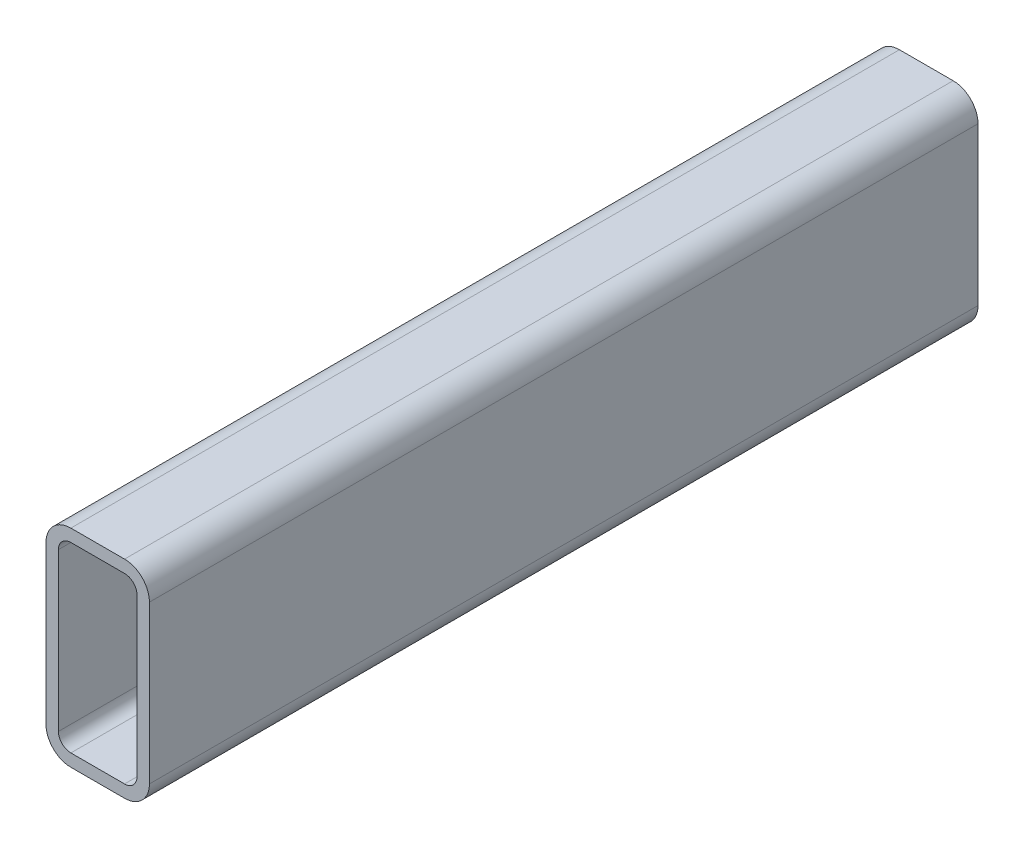
ISO-10303-21;
HEADER;
FILE_DESCRIPTION(('STEP AP214'),'2;1');
FILE_NAME('part.step','',(''),(''),'','','');
FILE_SCHEMA(('AUTOMOTIVE_DESIGN { 1 0 10303 214 1 1 1 1 }'));
ENDSEC;
DATA;
#1=APPLICATION_CONTEXT('core data for automotive mechanical design processes');
#2=APPLICATION_PROTOCOL_DEFINITION('international standard','automotive_design',2000,#1);
#3=PRODUCT_CONTEXT('',#1,'mechanical');
#4=PRODUCT('Part','Part','',(#3));
#5=PRODUCT_RELATED_PRODUCT_CATEGORY('part','',(#4));
#6=PRODUCT_DEFINITION_FORMATION('','',#4);
#7=PRODUCT_DEFINITION_CONTEXT('part definition',#1,'design');
#8=PRODUCT_DEFINITION('design','',#6,#7);
#9=PRODUCT_DEFINITION_SHAPE('','',#8);
#10=(LENGTH_UNIT() NAMED_UNIT(*) SI_UNIT(.MILLI.,.METRE.));
#11=(NAMED_UNIT(*) PLANE_ANGLE_UNIT() SI_UNIT($,.RADIAN.));
#12=(NAMED_UNIT(*) SI_UNIT($,.STERADIAN.) SOLID_ANGLE_UNIT());
#13=UNCERTAINTY_MEASURE_WITH_UNIT(LENGTH_MEASURE(1.E-05),#10,'distance_accuracy_value','');
#14=(GEOMETRIC_REPRESENTATION_CONTEXT(3) GLOBAL_UNCERTAINTY_ASSIGNED_CONTEXT((#13)) GLOBAL_UNIT_ASSIGNED_CONTEXT((#10,
#11,#12)) REPRESENTATION_CONTEXT('',''));
#15=CARTESIAN_POINT('',(0.,0.,0.));
#16=DIRECTION('',(0.,0.,1.));
#17=DIRECTION('',(1.,0.,0.));
#18=AXIS2_PLACEMENT_3D('',#15,#16,#17);
#19=CARTESIAN_POINT('',(6.00000000000001,6.00000000000006,200.000000000002));
#20=DIRECTION('',(0.,0.,-1.00000000000001));
#21=DIRECTION('',(-1.,0.,0.));
#22=AXIS2_PLACEMENT_3D('',#19,#20,#21);
#23=PLANE('',#22);
#24=CARTESIAN_POINT('',(6.00000000000001,6.00000000000006,200.000000000002));
#25=DIRECTION('',(0.,0.,1.00000000000001));
#26=DIRECTION('',(-1.,0.,0.));
#27=AXIS2_PLACEMENT_3D('',#24,#25,#26);
#28=CIRCLE('',#27,6.);
#29=CARTESIAN_POINT('',(0.,5.99999999999862,200.000000000002));
#30=VERTEX_POINT('',#29);
#31=CARTESIAN_POINT('',(6.00000000000001,0.,200.000000000002));
#32=VERTEX_POINT('',#31);
#33=EDGE_CURVE('E214',#30,#32,#28,.T.);
#34=ORIENTED_EDGE('',*,*,#33,.T.);
#35=DIRECTION('',(1.,0.,0.));
#36=VECTOR('',#35,1.);
#37=CARTESIAN_POINT('',(6.00000000000001,0.,200.000000000002));
#38=LINE('',#37,#36);
#39=CARTESIAN_POINT('',(18.9611964303452,-7.21644966006352E-13,200.000000000002));
#40=VERTEX_POINT('',#39);
#41=EDGE_CURVE('E217',#32,#40,#38,.T.);
#42=ORIENTED_EDGE('',*,*,#41,.T.);
#43=CARTESIAN_POINT('',(18.9611964303452,6.00000000000006,200.000000000002));
#44=DIRECTION('',(0.,0.,1.00000000000001));
#45=DIRECTION('',(1.,0.,0.));
#46=AXIS2_PLACEMENT_3D('',#43,#44,#45);
#47=CIRCLE('',#46,6.);
#48=CARTESIAN_POINT('',(24.9611964303452,6.00000000000006,200.000000000002));
#49=VERTEX_POINT('',#48);
#50=EDGE_CURVE('E220',#40,#49,#47,.T.);
#51=ORIENTED_EDGE('',*,*,#50,.T.);
#52=DIRECTION('',(0.,1.00000000000001,0.));
#53=VECTOR('',#52,1.);
#54=CARTESIAN_POINT('',(24.9611964303452,44.,200.000000000002));
#55=LINE('',#54,#53);
#56=CARTESIAN_POINT('',(24.9611964303452,44.,200.000000000002));
#57=VERTEX_POINT('',#56);
#58=EDGE_CURVE('E222',#49,#57,#55,.T.);
#59=ORIENTED_EDGE('',*,*,#58,.T.);
#60=CARTESIAN_POINT('',(18.9611964303452,44.,200.000000000002));
#61=DIRECTION('',(0.,0.,1.00000000000001));
#62=DIRECTION('',(-1.,0.,0.));
#63=AXIS2_PLACEMENT_3D('',#60,#61,#62);
#64=CIRCLE('',#63,6.00000000000001);
#65=CARTESIAN_POINT('',(18.9611964303452,50.0000000000001,200.000000000002));
#66=VERTEX_POINT('',#65);
#67=EDGE_CURVE('E224',#57,#66,#64,.T.);
#68=ORIENTED_EDGE('',*,*,#67,.T.);
#69=DIRECTION('',(-1.,0.,0.));
#70=VECTOR('',#69,1.);
#71=CARTESIAN_POINT('',(6.00000000000001,50.0000000000001,200.000000000002));
#72=LINE('',#71,#70);
#73=CARTESIAN_POINT('',(6.00000000000001,50.0000000000001,200.000000000002));
#74=VERTEX_POINT('',#73);
#75=EDGE_CURVE('E226',#66,#74,#72,.T.);
#76=ORIENTED_EDGE('',*,*,#75,.T.);
#77=CARTESIAN_POINT('',(6.00000000000001,44.0000000000001,200.000000000002));
#78=DIRECTION('',(0.,0.,1.00000000000001));
#79=DIRECTION('',(1.,0.,0.));
#80=AXIS2_PLACEMENT_3D('',#77,#78,#79);
#81=CIRCLE('',#80,6.);
#82=CARTESIAN_POINT('',(0.,43.9999999999986,200.000000000002));
#83=VERTEX_POINT('',#82);
#84=EDGE_CURVE('E228',#74,#83,#81,.T.);
#85=ORIENTED_EDGE('',*,*,#84,.T.);
#86=DIRECTION('',(0.,-1.00000000000001,0.));
#87=VECTOR('',#86,1.);
#88=CARTESIAN_POINT('',(0.,43.9999999999986,200.000000000002));
#89=LINE('',#88,#87);
#90=EDGE_CURVE('E230',#83,#30,#89,.T.);
#91=ORIENTED_EDGE('',*,*,#90,.T.);
#92=EDGE_LOOP('',(#34,#42,#51,#59,#68,#76,#85,#91));
#93=FACE_BOUND('',#92,.T.);
#94=CARTESIAN_POINT('',(6.00000000000001,6.00000000000006,200.000000000002));
#95=DIRECTION('',(0.,0.,1.00000000000001));
#96=DIRECTION('',(-1.,0.,0.));
#97=AXIS2_PLACEMENT_3D('',#94,#95,#96);
#98=CIRCLE('',#97,3.);
#99=CARTESIAN_POINT('',(3.,5.99999999999862,200.000000000002));
#100=VERTEX_POINT('',#99);
#101=CARTESIAN_POINT('',(6.00000000000001,3.00000000000006,200.000000000002));
#102=VERTEX_POINT('',#101);
#103=EDGE_CURVE('E149',#100,#102,#98,.T.);
#104=ORIENTED_EDGE('',*,*,#103,.F.);
#105=DIRECTION('',(0.,-1.00000000000001,0.));
#106=VECTOR('',#105,1.);
#107=CARTESIAN_POINT('',(3.,43.9999999999986,200.000000000002));
#108=LINE('',#107,#106);
#109=CARTESIAN_POINT('',(3.,43.9999999999986,200.000000000002));
#110=VERTEX_POINT('',#109);
#111=EDGE_CURVE('E182',#110,#100,#108,.T.);
#112=ORIENTED_EDGE('',*,*,#111,.F.);
#113=CARTESIAN_POINT('',(6.00000000000001,44.0000000000001,200.000000000002));
#114=DIRECTION('',(0.,0.,1.00000000000001));
#115=DIRECTION('',(1.,0.,0.));
#116=AXIS2_PLACEMENT_3D('',#113,#114,#115);
#117=CIRCLE('',#116,3.);
#118=CARTESIAN_POINT('',(6.00000000000001,47.0000000000002,200.000000000002));
#119=VERTEX_POINT('',#118);
#120=EDGE_CURVE('E180',#119,#110,#117,.T.);
#121=ORIENTED_EDGE('',*,*,#120,.F.);
#122=DIRECTION('',(-1.,0.,0.));
#123=VECTOR('',#122,1.);
#124=CARTESIAN_POINT('',(6.00000000000001,47.0000000000002,200.000000000002));
#125=LINE('',#124,#123);
#126=CARTESIAN_POINT('',(18.9611964303452,47.,200.000000000002));
#127=VERTEX_POINT('',#126);
#128=EDGE_CURVE('E178',#127,#119,#125,.T.);
#129=ORIENTED_EDGE('',*,*,#128,.F.);
#130=CARTESIAN_POINT('',(18.9611964303452,44.,200.000000000002));
#131=DIRECTION('',(0.,0.,1.00000000000001));
#132=DIRECTION('',(-1.,0.,0.));
#133=AXIS2_PLACEMENT_3D('',#130,#131,#132);
#134=CIRCLE('',#133,3.);
#135=CARTESIAN_POINT('',(21.9611964303452,44.,200.000000000002));
#136=VERTEX_POINT('',#135);
#137=EDGE_CURVE('E176',#136,#127,#134,.T.);
#138=ORIENTED_EDGE('',*,*,#137,.F.);
#139=DIRECTION('',(0.,1.00000000000001,0.));
#140=VECTOR('',#139,1.);
#141=CARTESIAN_POINT('',(21.9611964303452,44.,200.000000000002));
#142=LINE('',#141,#140);
#143=CARTESIAN_POINT('',(21.9611964303452,6.00000000000006,200.000000000002));
#144=VERTEX_POINT('',#143);
#145=EDGE_CURVE('E172',#144,#136,#142,.T.);
#146=ORIENTED_EDGE('',*,*,#145,.F.);
#147=CARTESIAN_POINT('',(18.9611964303452,6.00000000000006,200.000000000002));
#148=DIRECTION('',(0.,0.,1.00000000000001));
#149=DIRECTION('',(1.,0.,0.));
#150=AXIS2_PLACEMENT_3D('',#147,#148,#149);
#151=CIRCLE('',#150,3.);
#152=CARTESIAN_POINT('',(18.9611964303452,3.00000000000006,200.000000000002));
#153=VERTEX_POINT('',#152);
#154=EDGE_CURVE('E170',#153,#144,#151,.T.);
#155=ORIENTED_EDGE('',*,*,#154,.F.);
#156=DIRECTION('',(1.,0.,0.));
#157=VECTOR('',#156,1.);
#158=CARTESIAN_POINT('',(6.00000000000001,3.00000000000006,200.000000000002));
#159=LINE('',#158,#157);
#160=EDGE_CURVE('E157',#102,#153,#159,.T.);
#161=ORIENTED_EDGE('',*,*,#160,.F.);
#162=EDGE_LOOP('',(#104,#112,#121,#129,#138,#146,#155,#161));
#163=FACE_BOUND('',#162,.T.);
#164=ADVANCED_FACE('F36',(#93,#163),#23,.F.);
#165=CARTESIAN_POINT('',(6.00000000000001,6.00000000000139,0.));
#166=DIRECTION('',(0.,0.,-1.00000000000001));
#167=DIRECTION('',(-1.,0.,0.));
#168=AXIS2_PLACEMENT_3D('',#165,#166,#167);
#169=PLANE('',#168);
#170=CARTESIAN_POINT('',(6.00000000000001,6.00000000000139,0.));
#171=DIRECTION('',(0.,0.,1.00000000000001));
#172=DIRECTION('',(-1.,0.,0.));
#173=AXIS2_PLACEMENT_3D('',#170,#171,#172);
#174=CIRCLE('',#173,6.);
#175=CARTESIAN_POINT('',(0.,5.99999999999995,0.));
#176=VERTEX_POINT('',#175);
#177=CARTESIAN_POINT('',(6.00000000000001,0.,0.));
#178=VERTEX_POINT('',#177);
#179=EDGE_CURVE('E165',#176,#178,#174,.T.);
#180=ORIENTED_EDGE('',*,*,#179,.F.);
#181=DIRECTION('',(0.,-1.00000000000001,0.));
#182=VECTOR('',#181,1.);
#183=CARTESIAN_POINT('',(0.,44.,-6.66133814775094E-13));
#184=LINE('',#183,#182);
#185=CARTESIAN_POINT('',(0.,44.,-6.66133814775094E-13));
#186=VERTEX_POINT('',#185);
#187=EDGE_CURVE('E218',#186,#176,#184,.T.);
#188=ORIENTED_EDGE('',*,*,#187,.F.);
#189=CARTESIAN_POINT('',(6.00000000000001,44.0000000000014,-6.66133814775094E-13));
#190=DIRECTION('',(0.,0.,1.00000000000001));
#191=DIRECTION('',(1.,0.,0.));
#192=AXIS2_PLACEMENT_3D('',#189,#190,#191);
#193=CIRCLE('',#192,6.);
#194=CARTESIAN_POINT('',(6.00000000000001,50.0000000000014,-6.66133814775094E-13));
#195=VERTEX_POINT('',#194);
#196=EDGE_CURVE('E245',#195,#186,#193,.T.);
#197=ORIENTED_EDGE('',*,*,#196,.F.);
#198=DIRECTION('',(-1.,0.,0.));
#199=VECTOR('',#198,1.);
#200=CARTESIAN_POINT('',(6.00000000000001,50.0000000000014,-6.66133814775094E-13));
#201=LINE('',#200,#199);
#202=CARTESIAN_POINT('',(18.9611964303452,50.0000000000013,0.));
#203=VERTEX_POINT('',#202);
#204=EDGE_CURVE('E243',#203,#195,#201,.T.);
#205=ORIENTED_EDGE('',*,*,#204,.F.);
#206=CARTESIAN_POINT('',(18.9611964303452,44.0000000000013,0.));
#207=DIRECTION('',(0.,0.,1.00000000000001));
#208=DIRECTION('',(-1.,0.,0.));
#209=AXIS2_PLACEMENT_3D('',#206,#207,#208);
#210=CIRCLE('',#209,6.00000000000001);
#211=CARTESIAN_POINT('',(24.9611964303452,44.,0.));
#212=VERTEX_POINT('',#211);
#213=EDGE_CURVE('E241',#212,#203,#210,.T.);
#214=ORIENTED_EDGE('',*,*,#213,.F.);
#215=DIRECTION('',(0.,1.00000000000001,0.));
#216=VECTOR('',#215,1.);
#217=CARTESIAN_POINT('',(24.9611964303452,44.,0.));
#218=LINE('',#217,#216);
#219=CARTESIAN_POINT('',(24.9611964303452,6.00000000000006,0.));
#220=VERTEX_POINT('',#219);
#221=EDGE_CURVE('E239',#220,#212,#218,.T.);
#222=ORIENTED_EDGE('',*,*,#221,.F.);
#223=CARTESIAN_POINT('',(18.9611964303452,6.00000000000006,0.));
#224=DIRECTION('',(0.,0.,1.00000000000001));
#225=DIRECTION('',(1.,0.,0.));
#226=AXIS2_PLACEMENT_3D('',#223,#224,#225);
#227=CIRCLE('',#226,6.);
#228=CARTESIAN_POINT('',(18.9611964303452,-7.21644966006352E-13,0.));
#229=VERTEX_POINT('',#228);
#230=EDGE_CURVE('E237',#229,#220,#227,.T.);
#231=ORIENTED_EDGE('',*,*,#230,.F.);
#232=DIRECTION('',(1.,0.,0.));
#233=VECTOR('',#232,1.);
#234=CARTESIAN_POINT('',(6.00000000000001,0.,0.));
#235=LINE('',#234,#233);
#236=EDGE_CURVE('E235',#178,#229,#235,.T.);
#237=ORIENTED_EDGE('',*,*,#236,.F.);
#238=EDGE_LOOP('',(#180,#188,#197,#205,#214,#222,#231,#237));
#239=FACE_BOUND('',#238,.T.);
#240=DIRECTION('',(0.,-1.00000000000001,0.));
#241=VECTOR('',#240,1.);
#242=CARTESIAN_POINT('',(3.,44.,-6.66133814775094E-13));
#243=LINE('',#242,#241);
#244=CARTESIAN_POINT('',(3.,44.,-6.66133814775094E-13));
#245=VERTEX_POINT('',#244);
#246=CARTESIAN_POINT('',(3.,5.99999999999995,0.));
#247=VERTEX_POINT('',#246);
#248=EDGE_CURVE('E158',#245,#247,#243,.T.);
#249=ORIENTED_EDGE('',*,*,#248,.T.);
#250=CARTESIAN_POINT('',(6.00000000000001,6.00000000000139,0.));
#251=DIRECTION('',(0.,0.,1.00000000000001));
#252=DIRECTION('',(-1.,0.,0.));
#253=AXIS2_PLACEMENT_3D('',#250,#251,#252);
#254=CIRCLE('',#253,3.);
#255=CARTESIAN_POINT('',(6.00000000000001,3.00000000000006,0.));
#256=VERTEX_POINT('',#255);
#257=EDGE_CURVE('E59',#247,#256,#254,.T.);
#258=ORIENTED_EDGE('',*,*,#257,.T.);
#259=DIRECTION('',(1.,0.,0.));
#260=VECTOR('',#259,1.);
#261=CARTESIAN_POINT('',(6.00000000000001,3.00000000000006,0.));
#262=LINE('',#261,#260);
#263=CARTESIAN_POINT('',(18.9611964303452,3.00000000000006,0.));
#264=VERTEX_POINT('',#263);
#265=EDGE_CURVE('E164',#256,#264,#262,.T.);
#266=ORIENTED_EDGE('',*,*,#265,.T.);
#267=CARTESIAN_POINT('',(18.9611964303452,6.00000000000006,0.));
#268=DIRECTION('',(0.,0.,1.00000000000001));
#269=DIRECTION('',(1.,0.,0.));
#270=AXIS2_PLACEMENT_3D('',#267,#268,#269);
#271=CIRCLE('',#270,3.);
#272=CARTESIAN_POINT('',(21.9611964303452,6.00000000000006,0.));
#273=VERTEX_POINT('',#272);
#274=EDGE_CURVE('E186',#264,#273,#271,.T.);
#275=ORIENTED_EDGE('',*,*,#274,.T.);
#276=DIRECTION('',(0.,1.00000000000001,0.));
#277=VECTOR('',#276,1.);
#278=CARTESIAN_POINT('',(21.9611964303452,44.,0.));
#279=LINE('',#278,#277);
#280=CARTESIAN_POINT('',(21.9611964303452,44.,0.));
#281=VERTEX_POINT('',#280);
#282=EDGE_CURVE('E189',#273,#281,#279,.T.);
#283=ORIENTED_EDGE('',*,*,#282,.T.);
#284=CARTESIAN_POINT('',(18.9611964303452,44.0000000000013,0.));
#285=DIRECTION('',(0.,0.,1.00000000000001));
#286=DIRECTION('',(-1.,0.,0.));
#287=AXIS2_PLACEMENT_3D('',#284,#285,#286);
#288=CIRCLE('',#287,3.);
#289=CARTESIAN_POINT('',(18.9611964303452,47.0000000000013,0.));
#290=VERTEX_POINT('',#289);
#291=EDGE_CURVE('E192',#281,#290,#288,.T.);
#292=ORIENTED_EDGE('',*,*,#291,.T.);
#293=DIRECTION('',(-1.,0.,0.));
#294=VECTOR('',#293,1.);
#295=CARTESIAN_POINT('',(6.00000000000001,47.0000000000014,-6.66133814775094E-13));
#296=LINE('',#295,#294);
#297=CARTESIAN_POINT('',(6.00000000000001,47.0000000000014,-6.66133814775094E-13));
#298=VERTEX_POINT('',#297);
#299=EDGE_CURVE('E195',#290,#298,#296,.T.);
#300=ORIENTED_EDGE('',*,*,#299,.T.);
#301=CARTESIAN_POINT('',(6.00000000000001,44.0000000000014,-6.66133814775094E-13));
#302=DIRECTION('',(0.,0.,1.00000000000001));
#303=DIRECTION('',(1.,0.,0.));
#304=AXIS2_PLACEMENT_3D('',#301,#302,#303);
#305=CIRCLE('',#304,3.);
#306=EDGE_CURVE('E198',#298,#245,#305,.T.);
#307=ORIENTED_EDGE('',*,*,#306,.T.);
#308=EDGE_LOOP('',(#249,#258,#266,#275,#283,#292,#300,#307));
#309=FACE_BOUND('',#308,.T.);
#310=ADVANCED_FACE('F275',(#239,#309),#169,.T.);
#311=CARTESIAN_POINT('',(6.00000000000001,6.00000000000006,200.000000000002));
#312=DIRECTION('',(0.,0.,-1.00000000000001));
#313=DIRECTION('',(-1.,0.,0.));
#314=AXIS2_PLACEMENT_3D('',#311,#312,#313);
#315=CYLINDRICAL_SURFACE('',#314,6.);
#316=ORIENTED_EDGE('',*,*,#179,.T.);
#317=DIRECTION('',(0.,0.,-1.00000000000001));
#318=VECTOR('',#317,1.);
#319=CARTESIAN_POINT('',(6.00000000000001,0.,200.000000000002));
#320=LINE('',#319,#318);
#321=EDGE_CURVE('E11',#32,#178,#320,.T.);
#322=ORIENTED_EDGE('',*,*,#321,.F.);
#323=ORIENTED_EDGE('',*,*,#33,.F.);
#324=DIRECTION('',(0.,0.,-1.00000000000001));
#325=VECTOR('',#324,1.);
#326=CARTESIAN_POINT('',(0.,5.99999999999862,200.000000000002));
#327=LINE('',#326,#325);
#328=EDGE_CURVE('E232',#30,#176,#327,.T.);
#329=ORIENTED_EDGE('',*,*,#328,.T.);
#330=EDGE_LOOP('',(#316,#322,#323,#329));
#331=FACE_BOUND('',#330,.T.);
#332=ADVANCED_FACE('F38',(#331),#315,.T.);
#333=CARTESIAN_POINT('',(6.00000000000001,0.,200.000000000002));
#334=DIRECTION('',(0.,1.00000000000001,0.));
#335=DIRECTION('',(0.,0.,1.00000000000001));
#336=AXIS2_PLACEMENT_3D('',#333,#334,#335);
#337=PLANE('',#336);
#338=ORIENTED_EDGE('',*,*,#236,.T.);
#339=DIRECTION('',(0.,0.,-1.00000000000001));
#340=VECTOR('',#339,1.);
#341=CARTESIAN_POINT('',(18.9611964303452,-7.21644966006352E-13,200.000000000002));
#342=LINE('',#341,#340);
#343=EDGE_CURVE('E44',#40,#229,#342,.T.);
#344=ORIENTED_EDGE('',*,*,#343,.F.);
#345=ORIENTED_EDGE('',*,*,#41,.F.);
#346=ORIENTED_EDGE('',*,*,#321,.T.);
#347=EDGE_LOOP('',(#338,#344,#345,#346));
#348=FACE_BOUND('',#347,.T.);
#349=ADVANCED_FACE('F292',(#348),#337,.F.);
#350=CARTESIAN_POINT('',(18.9611964303452,6.00000000000006,200.000000000002));
#351=DIRECTION('',(0.,0.,-1.00000000000001));
#352=DIRECTION('',(-1.,0.,0.));
#353=AXIS2_PLACEMENT_3D('',#350,#351,#352);
#354=CYLINDRICAL_SURFACE('',#353,6.);
#355=ORIENTED_EDGE('',*,*,#230,.T.);
#356=DIRECTION('',(0.,0.,-1.00000000000001));
#357=VECTOR('',#356,1.);
#358=CARTESIAN_POINT('',(24.9611964303452,6.00000000000006,200.000000000002));
#359=LINE('',#358,#357);
#360=EDGE_CURVE('E262',#49,#220,#359,.T.);
#361=ORIENTED_EDGE('',*,*,#360,.F.);
#362=ORIENTED_EDGE('',*,*,#50,.F.);
#363=ORIENTED_EDGE('',*,*,#343,.T.);
#364=EDGE_LOOP('',(#355,#361,#362,#363));
#365=FACE_BOUND('',#364,.T.);
#366=ADVANCED_FACE('F269',(#365),#354,.T.);
#367=CARTESIAN_POINT('',(24.9611964303452,44.,200.000000000002));
#368=DIRECTION('',(-1.,0.,0.));
#369=DIRECTION('',(0.,-1.00000000000001,0.));
#370=AXIS2_PLACEMENT_3D('',#367,#368,#369);
#371=PLANE('',#370);
#372=ORIENTED_EDGE('',*,*,#221,.T.);
#373=DIRECTION('',(0.,0.,-1.00000000000001));
#374=VECTOR('',#373,1.);
#375=CARTESIAN_POINT('',(24.9611964303452,44.,200.000000000002));
#376=LINE('',#375,#374);
#377=EDGE_CURVE('E259',#57,#212,#376,.T.);
#378=ORIENTED_EDGE('',*,*,#377,.F.);
#379=ORIENTED_EDGE('',*,*,#58,.F.);
#380=ORIENTED_EDGE('',*,*,#360,.T.);
#381=EDGE_LOOP('',(#372,#378,#379,#380));
#382=FACE_BOUND('',#381,.T.);
#383=ADVANCED_FACE('F281',(#382),#371,.F.);
#384=CARTESIAN_POINT('',(18.9611964303452,44.,200.000000000002));
#385=DIRECTION('',(0.,0.,-1.00000000000001));
#386=DIRECTION('',(-1.,0.,0.));
#387=AXIS2_PLACEMENT_3D('',#384,#385,#386);
#388=CYLINDRICAL_SURFACE('',#387,6.00000000000001);
#389=ORIENTED_EDGE('',*,*,#213,.T.);
#390=DIRECTION('',(0.,0.,-1.00000000000001));
#391=VECTOR('',#390,1.);
#392=CARTESIAN_POINT('',(18.9611964303452,50.0000000000001,200.000000000002));
#393=LINE('',#392,#391);
#394=EDGE_CURVE('E256',#66,#203,#393,.T.);
#395=ORIENTED_EDGE('',*,*,#394,.F.);
#396=ORIENTED_EDGE('',*,*,#67,.F.);
#397=ORIENTED_EDGE('',*,*,#377,.T.);
#398=EDGE_LOOP('',(#389,#395,#396,#397));
#399=FACE_BOUND('',#398,.T.);
#400=ADVANCED_FACE('F285',(#399),#388,.T.);
#401=CARTESIAN_POINT('',(6.00000000000001,50.0000000000001,200.000000000002));
#402=DIRECTION('',(0.,-1.00000000000001,0.));
#403=DIRECTION('',(0.,0.,-1.00000000000001));
#404=AXIS2_PLACEMENT_3D('',#401,#402,#403);
#405=PLANE('',#404);
#406=ORIENTED_EDGE('',*,*,#204,.T.);
#407=DIRECTION('',(0.,0.,-1.00000000000001));
#408=VECTOR('',#407,1.);
#409=CARTESIAN_POINT('',(6.00000000000001,50.0000000000001,200.000000000002));
#410=LINE('',#409,#408);
#411=EDGE_CURVE('E253',#74,#195,#410,.T.);
#412=ORIENTED_EDGE('',*,*,#411,.F.);
#413=ORIENTED_EDGE('',*,*,#75,.F.);
#414=ORIENTED_EDGE('',*,*,#394,.T.);
#415=EDGE_LOOP('',(#406,#412,#413,#414));
#416=FACE_BOUND('',#415,.T.);
#417=ADVANCED_FACE('F305',(#416),#405,.F.);
#418=CARTESIAN_POINT('',(6.00000000000001,44.0000000000001,200.000000000002));
#419=DIRECTION('',(0.,0.,-1.00000000000001));
#420=DIRECTION('',(-1.,0.,0.));
#421=AXIS2_PLACEMENT_3D('',#418,#419,#420);
#422=CYLINDRICAL_SURFACE('',#421,6.);
#423=ORIENTED_EDGE('',*,*,#196,.T.);
#424=DIRECTION('',(0.,0.,-1.00000000000001));
#425=VECTOR('',#424,1.);
#426=CARTESIAN_POINT('',(0.,43.9999999999986,200.000000000002));
#427=LINE('',#426,#425);
#428=EDGE_CURVE('E250',#83,#186,#427,.T.);
#429=ORIENTED_EDGE('',*,*,#428,.F.);
#430=ORIENTED_EDGE('',*,*,#84,.F.);
#431=ORIENTED_EDGE('',*,*,#411,.T.);
#432=EDGE_LOOP('',(#423,#429,#430,#431));
#433=FACE_BOUND('',#432,.T.);
#434=ADVANCED_FACE('F303',(#433),#422,.T.);
#435=CARTESIAN_POINT('',(0.,43.9999999999986,200.000000000002));
#436=DIRECTION('',(1.,0.,0.));
#437=DIRECTION('',(0.,0.,-1.00000000000001));
#438=AXIS2_PLACEMENT_3D('',#435,#436,#437);
#439=PLANE('',#438);
#440=ORIENTED_EDGE('',*,*,#187,.T.);
#441=ORIENTED_EDGE('',*,*,#328,.F.);
#442=ORIENTED_EDGE('',*,*,#90,.F.);
#443=ORIENTED_EDGE('',*,*,#428,.T.);
#444=EDGE_LOOP('',(#440,#441,#442,#443));
#445=FACE_BOUND('',#444,.T.);
#446=ADVANCED_FACE('F298',(#445),#439,.F.);
#447=CARTESIAN_POINT('',(6.00000000000001,6.00000000000006,200.000000000002));
#448=DIRECTION('',(0.,0.,-1.00000000000001));
#449=DIRECTION('',(-1.,0.,0.));
#450=AXIS2_PLACEMENT_3D('',#447,#448,#449);
#451=CYLINDRICAL_SURFACE('',#450,3.);
#452=ORIENTED_EDGE('',*,*,#257,.F.);
#453=DIRECTION('',(0.,0.,-1.00000000000001));
#454=VECTOR('',#453,1.);
#455=CARTESIAN_POINT('',(3.,5.99999999999862,200.000000000002));
#456=LINE('',#455,#454);
#457=EDGE_CURVE('E153',#100,#247,#456,.T.);
#458=ORIENTED_EDGE('',*,*,#457,.F.);
#459=ORIENTED_EDGE('',*,*,#103,.T.);
#460=DIRECTION('',(0.,0.,-1.00000000000001));
#461=VECTOR('',#460,1.);
#462=CARTESIAN_POINT('',(6.00000000000001,3.00000000000006,200.000000000002));
#463=LINE('',#462,#461);
#464=EDGE_CURVE('E152',#102,#256,#463,.T.);
#465=ORIENTED_EDGE('',*,*,#464,.T.);
#466=EDGE_LOOP('',(#452,#458,#459,#465));
#467=FACE_BOUND('',#466,.T.);
#468=ADVANCED_FACE('F151',(#467),#451,.F.);
#469=CARTESIAN_POINT('',(6.00000000000001,3.00000000000006,200.000000000002));
#470=DIRECTION('',(0.,1.00000000000001,0.));
#471=DIRECTION('',(0.,0.,1.00000000000001));
#472=AXIS2_PLACEMENT_3D('',#469,#470,#471);
#473=PLANE('',#472);
#474=ORIENTED_EDGE('',*,*,#265,.F.);
#475=ORIENTED_EDGE('',*,*,#464,.F.);
#476=ORIENTED_EDGE('',*,*,#160,.T.);
#477=DIRECTION('',(0.,0.,-1.00000000000001));
#478=VECTOR('',#477,1.);
#479=CARTESIAN_POINT('',(18.9611964303452,3.00000000000006,200.000000000002));
#480=LINE('',#479,#478);
#481=EDGE_CURVE('E166',#153,#264,#480,.T.);
#482=ORIENTED_EDGE('',*,*,#481,.T.);
#483=EDGE_LOOP('',(#474,#475,#476,#482));
#484=FACE_BOUND('',#483,.T.);
#485=ADVANCED_FACE('F161',(#484),#473,.T.);
#486=CARTESIAN_POINT('',(18.9611964303452,6.00000000000006,200.000000000002));
#487=DIRECTION('',(0.,0.,-1.00000000000001));
#488=DIRECTION('',(-1.,0.,0.));
#489=AXIS2_PLACEMENT_3D('',#486,#487,#488);
#490=CYLINDRICAL_SURFACE('',#489,3.);
#491=ORIENTED_EDGE('',*,*,#274,.F.);
#492=ORIENTED_EDGE('',*,*,#481,.F.);
#493=ORIENTED_EDGE('',*,*,#154,.T.);
#494=DIRECTION('',(0.,0.,-1.00000000000001));
#495=VECTOR('',#494,1.);
#496=CARTESIAN_POINT('',(21.9611964303452,6.00000000000006,200.000000000002));
#497=LINE('',#496,#495);
#498=EDGE_CURVE('E211',#144,#273,#497,.T.);
#499=ORIENTED_EDGE('',*,*,#498,.T.);
#500=EDGE_LOOP('',(#491,#492,#493,#499));
#501=FACE_BOUND('',#500,.T.);
#502=ADVANCED_FACE('F330',(#501),#490,.F.);
#503=CARTESIAN_POINT('',(21.9611964303452,44.,200.000000000002));
#504=DIRECTION('',(-1.,0.,0.));
#505=DIRECTION('',(0.,0.,1.00000000000001));
#506=AXIS2_PLACEMENT_3D('',#503,#504,#505);
#507=PLANE('',#506);
#508=ORIENTED_EDGE('',*,*,#282,.F.);
#509=ORIENTED_EDGE('',*,*,#498,.F.);
#510=ORIENTED_EDGE('',*,*,#145,.T.);
#511=DIRECTION('',(0.,0.,-1.00000000000001));
#512=VECTOR('',#511,1.);
#513=CARTESIAN_POINT('',(21.9611964303452,44.,200.000000000002));
#514=LINE('',#513,#512);
#515=EDGE_CURVE('E209',#136,#281,#514,.T.);
#516=ORIENTED_EDGE('',*,*,#515,.T.);
#517=EDGE_LOOP('',(#508,#509,#510,#516));
#518=FACE_BOUND('',#517,.T.);
#519=ADVANCED_FACE('F334',(#518),#507,.T.);
#520=CARTESIAN_POINT('',(18.9611964303452,44.,200.000000000002));
#521=DIRECTION('',(0.,0.,-1.00000000000001));
#522=DIRECTION('',(-1.,0.,0.));
#523=AXIS2_PLACEMENT_3D('',#520,#521,#522);
#524=CYLINDRICAL_SURFACE('',#523,3.);
#525=ORIENTED_EDGE('',*,*,#291,.F.);
#526=ORIENTED_EDGE('',*,*,#515,.F.);
#527=ORIENTED_EDGE('',*,*,#137,.T.);
#528=DIRECTION('',(0.,0.,-1.00000000000001));
#529=VECTOR('',#528,1.);
#530=CARTESIAN_POINT('',(18.9611964303452,47.,200.000000000002));
#531=LINE('',#530,#529);
#532=EDGE_CURVE('E207',#127,#290,#531,.T.);
#533=ORIENTED_EDGE('',*,*,#532,.T.);
#534=EDGE_LOOP('',(#525,#526,#527,#533));
#535=FACE_BOUND('',#534,.T.);
#536=ADVANCED_FACE('F340',(#535),#524,.F.);
#537=CARTESIAN_POINT('',(6.00000000000001,47.0000000000002,200.000000000002));
#538=DIRECTION('',(0.,-1.00000000000001,0.));
#539=DIRECTION('',(0.,0.,-1.00000000000001));
#540=AXIS2_PLACEMENT_3D('',#537,#538,#539);
#541=PLANE('',#540);
#542=ORIENTED_EDGE('',*,*,#299,.F.);
#543=ORIENTED_EDGE('',*,*,#532,.F.);
#544=ORIENTED_EDGE('',*,*,#128,.T.);
#545=DIRECTION('',(0.,0.,-1.00000000000001));
#546=VECTOR('',#545,1.);
#547=CARTESIAN_POINT('',(6.00000000000001,47.0000000000002,200.000000000002));
#548=LINE('',#547,#546);
#549=EDGE_CURVE('E205',#119,#298,#548,.T.);
#550=ORIENTED_EDGE('',*,*,#549,.T.);
#551=EDGE_LOOP('',(#542,#543,#544,#550));
#552=FACE_BOUND('',#551,.T.);
#553=ADVANCED_FACE('F344',(#552),#541,.T.);
#554=CARTESIAN_POINT('',(6.00000000000001,44.0000000000001,200.000000000002));
#555=DIRECTION('',(0.,0.,-1.00000000000001));
#556=DIRECTION('',(-1.,0.,0.));
#557=AXIS2_PLACEMENT_3D('',#554,#555,#556);
#558=CYLINDRICAL_SURFACE('',#557,3.);
#559=ORIENTED_EDGE('',*,*,#306,.F.);
#560=ORIENTED_EDGE('',*,*,#549,.F.);
#561=ORIENTED_EDGE('',*,*,#120,.T.);
#562=DIRECTION('',(0.,0.,-1.00000000000001));
#563=VECTOR('',#562,1.);
#564=CARTESIAN_POINT('',(3.,43.9999999999986,200.000000000002));
#565=LINE('',#564,#563);
#566=EDGE_CURVE('E51',#110,#245,#565,.T.);
#567=ORIENTED_EDGE('',*,*,#566,.T.);
#568=EDGE_LOOP('',(#559,#560,#561,#567));
#569=FACE_BOUND('',#568,.T.);
#570=ADVANCED_FACE('F348',(#569),#558,.F.);
#571=CARTESIAN_POINT('',(3.,43.9999999999986,200.000000000002));
#572=DIRECTION('',(1.,0.,0.));
#573=DIRECTION('',(0.,0.,-1.00000000000001));
#574=AXIS2_PLACEMENT_3D('',#571,#572,#573);
#575=PLANE('',#574);
#576=ORIENTED_EDGE('',*,*,#248,.F.);
#577=ORIENTED_EDGE('',*,*,#566,.F.);
#578=ORIENTED_EDGE('',*,*,#111,.T.);
#579=ORIENTED_EDGE('',*,*,#457,.T.);
#580=EDGE_LOOP('',(#576,#577,#578,#579));
#581=FACE_BOUND('',#580,.T.);
#582=ADVANCED_FACE('F352',(#581),#575,.T.);
#583=CLOSED_SHELL('',(#164,#310,#332,#349,#366,#383,#400,#417,#434,#446,#468,#485,#502,#519,
#536,#553,#570,#582));
#584=MANIFOLD_SOLID_BREP('B2',#583);
#585=ADVANCED_BREP_SHAPE_REPRESENTATION('',(#18,#584),#14);
#586=SHAPE_DEFINITION_REPRESENTATION(#9,#585);
ENDSEC;
END-ISO-10303-21;
